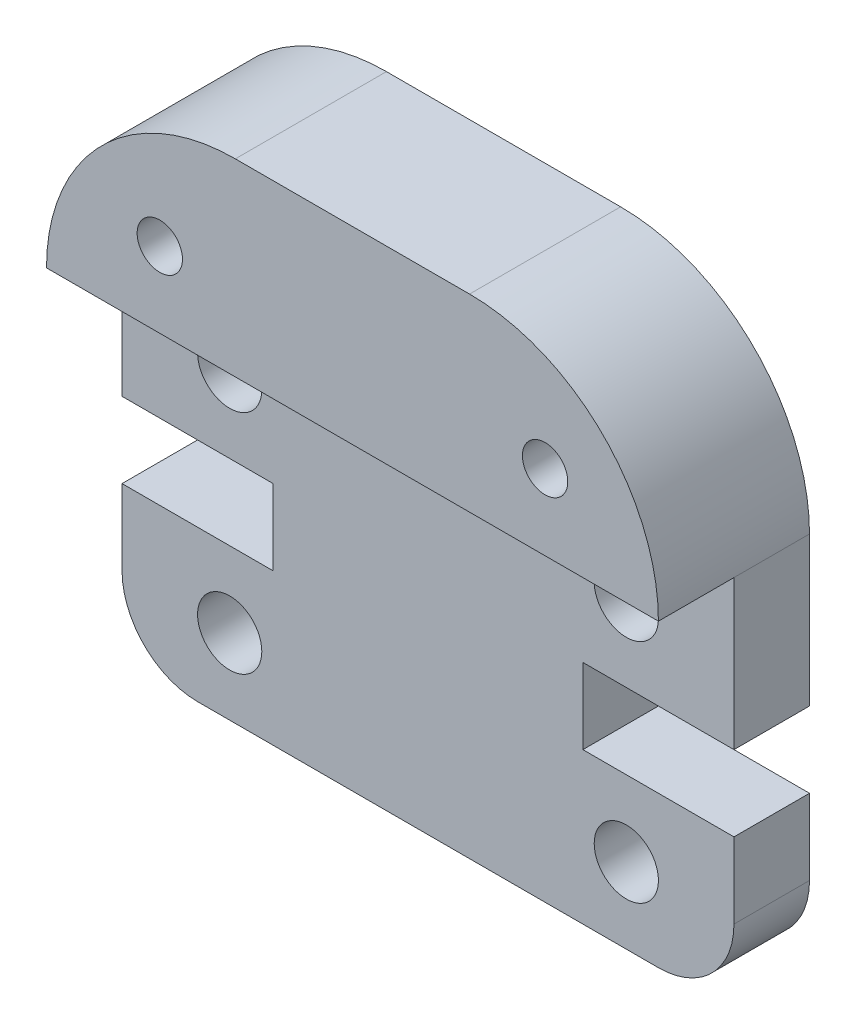
ISO-10303-21;
HEADER;
FILE_DESCRIPTION(('STEP AP214'),'2;1');
FILE_NAME('part.step','',(''),(''),'','','');
FILE_SCHEMA(('AUTOMOTIVE_DESIGN { 1 0 10303 214 1 1 1 1 }'));
ENDSEC;
DATA;
#1=APPLICATION_CONTEXT('core data for automotive mechanical design processes');
#2=APPLICATION_PROTOCOL_DEFINITION('international standard','automotive_design',2000,#1);
#3=PRODUCT_CONTEXT('',#1,'mechanical');
#4=PRODUCT('Part','Part','',(#3));
#5=PRODUCT_RELATED_PRODUCT_CATEGORY('part','',(#4));
#6=PRODUCT_DEFINITION_FORMATION('','',#4);
#7=PRODUCT_DEFINITION_CONTEXT('part definition',#1,'design');
#8=PRODUCT_DEFINITION('design','',#6,#7);
#9=PRODUCT_DEFINITION_SHAPE('','',#8);
#10=(LENGTH_UNIT() NAMED_UNIT(*) SI_UNIT(.MILLI.,.METRE.));
#11=(NAMED_UNIT(*) PLANE_ANGLE_UNIT() SI_UNIT($,.RADIAN.));
#12=(NAMED_UNIT(*) SI_UNIT($,.STERADIAN.) SOLID_ANGLE_UNIT());
#13=UNCERTAINTY_MEASURE_WITH_UNIT(LENGTH_MEASURE(1.E-05),#10,'distance_accuracy_value','');
#14=(GEOMETRIC_REPRESENTATION_CONTEXT(3) GLOBAL_UNCERTAINTY_ASSIGNED_CONTEXT((#13)) GLOBAL_UNIT_ASSIGNED_CONTEXT((#10,
#11,#12)) REPRESENTATION_CONTEXT('',''));
#15=CARTESIAN_POINT('',(0.,0.,0.));
#16=DIRECTION('',(0.,0.,1.));
#17=DIRECTION('',(1.,0.,0.));
#18=AXIS2_PLACEMENT_3D('',#15,#16,#17);
#19=CARTESIAN_POINT('',(14.2,2.,4.));
#20=DIRECTION('',(0.,0.,-1.));
#21=DIRECTION('',(-1.,0.,0.));
#22=AXIS2_PLACEMENT_3D('',#19,#20,#21);
#23=PLANE('',#22);
#24=CARTESIAN_POINT('',(3.00000000000321,11.942,4.));
#25=DIRECTION('',(0.,0.,1.));
#26=DIRECTION('',(1.,0.,0.));
#27=AXIS2_PLACEMENT_3D('',#24,#25,#26);
#28=CIRCLE('',#27,0.6);
#29=CARTESIAN_POINT('',(3.60000000000321,11.942,4.));
#30=VERTEX_POINT('',#29);
#31=EDGE_CURVE('E325',#30,#30,#28,.T.);
#32=ORIENTED_EDGE('',*,*,#31,.F.);
#33=EDGE_LOOP('',(#32));
#34=FACE_BOUND('',#33,.T.);
#35=CARTESIAN_POINT('',(13.1999999999968,11.942,4.));
#36=DIRECTION('',(0.,0.,1.));
#37=DIRECTION('',(-1.,0.,0.));
#38=AXIS2_PLACEMENT_3D('',#35,#36,#37);
#39=CIRCLE('',#38,0.6);
#40=CARTESIAN_POINT('',(12.5999999999968,11.942,4.));
#41=VERTEX_POINT('',#40);
#42=EDGE_CURVE('E331',#41,#41,#39,.T.);
#43=ORIENTED_EDGE('',*,*,#42,.F.);
#44=EDGE_LOOP('',(#43));
#45=FACE_BOUND('',#44,.T.);
#46=DIRECTION('',(1.,0.,0.));
#47=VECTOR('',#46,1.);
#48=CARTESIAN_POINT('',(16.2,9.945,4.));
#49=LINE('',#48,#47);
#50=CARTESIAN_POINT('',(0.,9.94499999999999,4.));
#51=VERTEX_POINT('',#50);
#52=CARTESIAN_POINT('',(16.2,9.945,4.));
#53=VERTEX_POINT('',#52);
#54=EDGE_CURVE('E277',#51,#53,#49,.T.);
#55=ORIENTED_EDGE('',*,*,#54,.T.);
#56=CARTESIAN_POINT('',(11.2,9.94499999999999,4.));
#57=DIRECTION('',(0.,0.,1.));
#58=DIRECTION('',(-1.,0.,0.));
#59=AXIS2_PLACEMENT_3D('',#56,#57,#58);
#60=CIRCLE('',#59,5.);
#61=CARTESIAN_POINT('',(11.2,14.945,4.));
#62=VERTEX_POINT('',#61);
#63=EDGE_CURVE('E131',#53,#62,#60,.T.);
#64=ORIENTED_EDGE('',*,*,#63,.T.);
#65=DIRECTION('',(-1.,0.,0.));
#66=VECTOR('',#65,1.);
#67=CARTESIAN_POINT('',(5.,14.945,4.));
#68=LINE('',#67,#66);
#69=CARTESIAN_POINT('',(5.,14.945,4.));
#70=VERTEX_POINT('',#69);
#71=EDGE_CURVE('E57',#62,#70,#68,.T.);
#72=ORIENTED_EDGE('',*,*,#71,.T.);
#73=CARTESIAN_POINT('',(5.,9.94499999999999,4.));
#74=DIRECTION('',(0.,0.,1.));
#75=DIRECTION('',(1.,0.,0.));
#76=AXIS2_PLACEMENT_3D('',#73,#74,#75);
#77=CIRCLE('',#76,5.);
#78=EDGE_CURVE('E122',#70,#51,#77,.T.);
#79=ORIENTED_EDGE('',*,*,#78,.T.);
#80=EDGE_LOOP('',(#55,#64,#72,#79));
#81=FACE_BOUND('',#80,.T.);
#82=ADVANCED_FACE('F32',(#34,#45,#81),#23,.F.);
#83=CARTESIAN_POINT('',(14.2,2.,4.));
#84=DIRECTION('',(0.,0.,-1.));
#85=DIRECTION('',(-1.,0.,0.));
#86=AXIS2_PLACEMENT_3D('',#83,#84,#85);
#87=CYLINDRICAL_SURFACE('',#86,2.);
#88=CARTESIAN_POINT('',(14.2,2.,2.));
#89=DIRECTION('',(0.,0.,1.));
#90=DIRECTION('',(1.,0.,0.));
#91=AXIS2_PLACEMENT_3D('',#88,#89,#90);
#92=CIRCLE('',#91,2.);
#93=CARTESIAN_POINT('',(14.2,0.,2.));
#94=VERTEX_POINT('',#93);
#95=CARTESIAN_POINT('',(16.2,2.,2.));
#96=VERTEX_POINT('',#95);
#97=EDGE_CURVE('E119',#94,#96,#92,.T.);
#98=ORIENTED_EDGE('',*,*,#97,.F.);
#99=DIRECTION('',(0.,0.,-1.));
#100=VECTOR('',#99,1.);
#101=CARTESIAN_POINT('',(14.2,0.,4.));
#102=LINE('',#101,#100);
#103=CARTESIAN_POINT('',(14.2,0.,0.));
#104=VERTEX_POINT('',#103);
#105=EDGE_CURVE('E112',#94,#104,#102,.T.);
#106=ORIENTED_EDGE('',*,*,#105,.T.);
#107=CARTESIAN_POINT('',(14.2,2.,0.));
#108=DIRECTION('',(0.,0.,1.));
#109=DIRECTION('',(-1.,0.,0.));
#110=AXIS2_PLACEMENT_3D('',#107,#108,#109);
#111=CIRCLE('',#110,2.);
#112=CARTESIAN_POINT('',(16.2,2.,0.));
#113=VERTEX_POINT('',#112);
#114=EDGE_CURVE('E116',#104,#113,#111,.T.);
#115=ORIENTED_EDGE('',*,*,#114,.T.);
#116=DIRECTION('',(0.,0.,-1.));
#117=VECTOR('',#116,1.);
#118=CARTESIAN_POINT('',(16.2,2.,4.));
#119=LINE('',#118,#117);
#120=EDGE_CURVE('E11',#96,#113,#119,.T.);
#121=ORIENTED_EDGE('',*,*,#120,.F.);
#122=EDGE_LOOP('',(#98,#106,#115,#121));
#123=FACE_BOUND('',#122,.T.);
#124=ADVANCED_FACE('F34',(#123),#87,.T.);
#125=CARTESIAN_POINT('',(16.2,2.,4.));
#126=DIRECTION('',(-1.,0.,0.));
#127=DIRECTION('',(0.,0.,1.));
#128=AXIS2_PLACEMENT_3D('',#125,#126,#127);
#129=PLANE('',#128);
#130=DIRECTION('',(0.,-1.,0.));
#131=VECTOR('',#130,1.);
#132=CARTESIAN_POINT('',(16.2,0.,2.));
#133=LINE('',#132,#131);
#134=CARTESIAN_POINT('',(16.2,4.,2.));
#135=VERTEX_POINT('',#134);
#136=EDGE_CURVE('E340',#135,#96,#133,.T.);
#137=ORIENTED_EDGE('',*,*,#136,.T.);
#138=ORIENTED_EDGE('',*,*,#120,.T.);
#139=DIRECTION('',(0.,1.,0.));
#140=VECTOR('',#139,1.);
#141=CARTESIAN_POINT('',(16.2,2.,0.));
#142=LINE('',#141,#140);
#143=CARTESIAN_POINT('',(16.2,4.,0.));
#144=VERTEX_POINT('',#143);
#145=EDGE_CURVE('E139',#113,#144,#142,.T.);
#146=ORIENTED_EDGE('',*,*,#145,.T.);
#147=DIRECTION('',(0.,0.,-1.));
#148=VECTOR('',#147,1.);
#149=CARTESIAN_POINT('',(16.2,4.,4.));
#150=LINE('',#149,#148);
#151=EDGE_CURVE('E41',#135,#144,#150,.T.);
#152=ORIENTED_EDGE('',*,*,#151,.F.);
#153=EDGE_LOOP('',(#137,#138,#146,#152));
#154=FACE_BOUND('',#153,.T.);
#155=ADVANCED_FACE('F226',(#154),#129,.F.);
#156=CARTESIAN_POINT('',(12.2,4.,4.));
#157=DIRECTION('',(0.,-1.,0.));
#158=DIRECTION('',(1.,0.,0.));
#159=AXIS2_PLACEMENT_3D('',#156,#157,#158);
#160=PLANE('',#159);
#161=DIRECTION('',(-1.,0.,0.));
#162=VECTOR('',#161,1.);
#163=CARTESIAN_POINT('',(12.2,4.,2.));
#164=LINE('',#163,#162);
#165=CARTESIAN_POINT('',(12.2,4.,2.));
#166=VERTEX_POINT('',#165);
#167=EDGE_CURVE('E223',#135,#166,#164,.T.);
#168=ORIENTED_EDGE('',*,*,#167,.F.);
#169=ORIENTED_EDGE('',*,*,#151,.T.);
#170=DIRECTION('',(-1.,0.,0.));
#171=VECTOR('',#170,1.);
#172=CARTESIAN_POINT('',(12.2,4.,0.));
#173=LINE('',#172,#171);
#174=CARTESIAN_POINT('',(12.2,4.,0.));
#175=VERTEX_POINT('',#174);
#176=EDGE_CURVE('E142',#144,#175,#173,.T.);
#177=ORIENTED_EDGE('',*,*,#176,.T.);
#178=DIRECTION('',(0.,0.,-1.));
#179=VECTOR('',#178,1.);
#180=CARTESIAN_POINT('',(12.2,4.,4.));
#181=LINE('',#180,#179);
#182=EDGE_CURVE('E213',#166,#175,#181,.T.);
#183=ORIENTED_EDGE('',*,*,#182,.F.);
#184=EDGE_LOOP('',(#168,#169,#177,#183));
#185=FACE_BOUND('',#184,.T.);
#186=ADVANCED_FACE('F218',(#185),#160,.F.);
#187=CARTESIAN_POINT('',(12.2,6.,4.));
#188=DIRECTION('',(-1.,0.,0.));
#189=DIRECTION('',(0.,0.,1.));
#190=AXIS2_PLACEMENT_3D('',#187,#188,#189);
#191=PLANE('',#190);
#192=DIRECTION('',(0.,1.,0.));
#193=VECTOR('',#192,1.);
#194=CARTESIAN_POINT('',(12.2,6.,2.));
#195=LINE('',#194,#193);
#196=CARTESIAN_POINT('',(12.2,6.,2.));
#197=VERTEX_POINT('',#196);
#198=EDGE_CURVE('E235',#166,#197,#195,.T.);
#199=ORIENTED_EDGE('',*,*,#198,.F.);
#200=ORIENTED_EDGE('',*,*,#182,.T.);
#201=DIRECTION('',(0.,1.,0.));
#202=VECTOR('',#201,1.);
#203=CARTESIAN_POINT('',(12.2,6.,0.));
#204=LINE('',#203,#202);
#205=CARTESIAN_POINT('',(12.2,6.,0.));
#206=VERTEX_POINT('',#205);
#207=EDGE_CURVE('E152',#175,#206,#204,.T.);
#208=ORIENTED_EDGE('',*,*,#207,.T.);
#209=DIRECTION('',(0.,0.,-1.));
#210=VECTOR('',#209,1.);
#211=CARTESIAN_POINT('',(12.2,6.,4.));
#212=LINE('',#211,#210);
#213=EDGE_CURVE('E211',#197,#206,#212,.T.);
#214=ORIENTED_EDGE('',*,*,#213,.F.);
#215=EDGE_LOOP('',(#199,#200,#208,#214));
#216=FACE_BOUND('',#215,.T.);
#217=ADVANCED_FACE('F232',(#216),#191,.F.);
#218=CARTESIAN_POINT('',(16.2,6.00000000000001,4.));
#219=DIRECTION('',(0.,1.,0.));
#220=DIRECTION('',(-1.,0.,0.));
#221=AXIS2_PLACEMENT_3D('',#218,#219,#220);
#222=PLANE('',#221);
#223=DIRECTION('',(1.,0.,0.));
#224=VECTOR('',#223,1.);
#225=CARTESIAN_POINT('',(16.2,6.00000000000001,2.));
#226=LINE('',#225,#224);
#227=CARTESIAN_POINT('',(16.2,6.00000000000001,2.));
#228=VERTEX_POINT('',#227);
#229=EDGE_CURVE('E307',#197,#228,#226,.T.);
#230=ORIENTED_EDGE('',*,*,#229,.F.);
#231=ORIENTED_EDGE('',*,*,#213,.T.);
#232=DIRECTION('',(1.,0.,0.));
#233=VECTOR('',#232,1.);
#234=CARTESIAN_POINT('',(16.2,6.00000000000001,0.));
#235=LINE('',#234,#233);
#236=CARTESIAN_POINT('',(16.2,6.00000000000001,0.));
#237=VERTEX_POINT('',#236);
#238=EDGE_CURVE('E155',#206,#237,#235,.T.);
#239=ORIENTED_EDGE('',*,*,#238,.T.);
#240=DIRECTION('',(0.,0.,-1.));
#241=VECTOR('',#240,1.);
#242=CARTESIAN_POINT('',(16.2,6.00000000000001,4.));
#243=LINE('',#242,#241);
#244=EDGE_CURVE('E209',#228,#237,#243,.T.);
#245=ORIENTED_EDGE('',*,*,#244,.F.);
#246=EDGE_LOOP('',(#230,#231,#239,#245));
#247=FACE_BOUND('',#246,.T.);
#248=ADVANCED_FACE('F352',(#247),#222,.F.);
#249=CARTESIAN_POINT('',(16.2,9.945,4.));
#250=DIRECTION('',(-1.,0.,0.));
#251=DIRECTION('',(0.,-1.,0.));
#252=AXIS2_PLACEMENT_3D('',#249,#250,#251);
#253=PLANE('',#252);
#254=CARTESIAN_POINT('',(16.2,9.945,2.));
#255=VERTEX_POINT('',#254);
#256=EDGE_CURVE('E286',#255,#228,#133,.T.);
#257=ORIENTED_EDGE('',*,*,#256,.T.);
#258=ORIENTED_EDGE('',*,*,#244,.T.);
#259=DIRECTION('',(0.,1.,0.));
#260=VECTOR('',#259,1.);
#261=CARTESIAN_POINT('',(16.2,9.945,0.));
#262=LINE('',#261,#260);
#263=CARTESIAN_POINT('',(16.2,9.945,0.));
#264=VERTEX_POINT('',#263);
#265=EDGE_CURVE('E158',#237,#264,#262,.T.);
#266=ORIENTED_EDGE('',*,*,#265,.T.);
#267=DIRECTION('',(0.,0.,-1.));
#268=VECTOR('',#267,1.);
#269=CARTESIAN_POINT('',(16.2,9.945,4.));
#270=LINE('',#269,#268);
#271=EDGE_CURVE('E205',#255,#264,#270,.T.);
#272=ORIENTED_EDGE('',*,*,#271,.F.);
#273=EDGE_LOOP('',(#257,#258,#266,#272));
#274=FACE_BOUND('',#273,.T.);
#275=ADVANCED_FACE('F348',(#274),#253,.F.);
#276=CARTESIAN_POINT('',(0.,9.94499999999999,4.));
#277=DIRECTION('',(1.,0.,0.));
#278=DIRECTION('',(0.,0.,-1.));
#279=AXIS2_PLACEMENT_3D('',#276,#277,#278);
#280=PLANE('',#279);
#281=DIRECTION('',(0.,1.,0.));
#282=VECTOR('',#281,1.);
#283=CARTESIAN_POINT('',(0.,9.94499999999999,2.));
#284=LINE('',#283,#282);
#285=CARTESIAN_POINT('',(0.,6.00000000000001,2.));
#286=VERTEX_POINT('',#285);
#287=CARTESIAN_POINT('',(0.,9.94499999999999,2.));
#288=VERTEX_POINT('',#287);
#289=EDGE_CURVE('E283',#286,#288,#284,.T.);
#290=ORIENTED_EDGE('',*,*,#289,.T.);
#291=DIRECTION('',(0.,0.,-1.));
#292=VECTOR('',#291,1.);
#293=CARTESIAN_POINT('',(0.,9.94499999999999,4.));
#294=LINE('',#293,#292);
#295=CARTESIAN_POINT('',(0.,9.94499999999999,0.));
#296=VERTEX_POINT('',#295);
#297=EDGE_CURVE('E195',#288,#296,#294,.T.);
#298=ORIENTED_EDGE('',*,*,#297,.T.);
#299=DIRECTION('',(0.,-1.,0.));
#300=VECTOR('',#299,1.);
#301=CARTESIAN_POINT('',(0.,9.94499999999999,0.));
#302=LINE('',#301,#300);
#303=CARTESIAN_POINT('',(0.,6.00000000000001,0.));
#304=VERTEX_POINT('',#303);
#305=EDGE_CURVE('E168',#296,#304,#302,.T.);
#306=ORIENTED_EDGE('',*,*,#305,.T.);
#307=DIRECTION('',(0.,0.,-1.));
#308=VECTOR('',#307,1.);
#309=CARTESIAN_POINT('',(0.,6.00000000000001,4.));
#310=LINE('',#309,#308);
#311=EDGE_CURVE('E193',#286,#304,#310,.T.);
#312=ORIENTED_EDGE('',*,*,#311,.F.);
#313=EDGE_LOOP('',(#290,#298,#306,#312));
#314=FACE_BOUND('',#313,.T.);
#315=ADVANCED_FACE('F292',(#314),#280,.F.);
#316=CARTESIAN_POINT('',(0.,6.00000000000001,4.));
#317=DIRECTION('',(0.,1.,0.));
#318=DIRECTION('',(0.,0.,1.));
#319=AXIS2_PLACEMENT_3D('',#316,#317,#318);
#320=PLANE('',#319);
#321=DIRECTION('',(1.,0.,0.));
#322=VECTOR('',#321,1.);
#323=CARTESIAN_POINT('',(0.,6.00000000000001,2.));
#324=LINE('',#323,#322);
#325=CARTESIAN_POINT('',(4.,6.00000000000001,2.));
#326=VERTEX_POINT('',#325);
#327=EDGE_CURVE('E305',#286,#326,#324,.T.);
#328=ORIENTED_EDGE('',*,*,#327,.F.);
#329=ORIENTED_EDGE('',*,*,#311,.T.);
#330=DIRECTION('',(1.,0.,0.));
#331=VECTOR('',#330,1.);
#332=CARTESIAN_POINT('',(0.,6.00000000000001,0.));
#333=LINE('',#332,#331);
#334=CARTESIAN_POINT('',(4.,6.00000000000001,0.));
#335=VERTEX_POINT('',#334);
#336=EDGE_CURVE('E171',#304,#335,#333,.T.);
#337=ORIENTED_EDGE('',*,*,#336,.T.);
#338=DIRECTION('',(0.,0.,-1.));
#339=VECTOR('',#338,1.);
#340=CARTESIAN_POINT('',(4.,6.00000000000001,4.));
#341=LINE('',#340,#339);
#342=EDGE_CURVE('E191',#326,#335,#341,.T.);
#343=ORIENTED_EDGE('',*,*,#342,.F.);
#344=EDGE_LOOP('',(#328,#329,#337,#343));
#345=FACE_BOUND('',#344,.T.);
#346=ADVANCED_FACE('F304',(#345),#320,.F.);
#347=CARTESIAN_POINT('',(4.,6.00000000000001,4.));
#348=DIRECTION('',(1.,0.,0.));
#349=DIRECTION('',(0.,0.,-1.));
#350=AXIS2_PLACEMENT_3D('',#347,#348,#349);
#351=PLANE('',#350);
#352=DIRECTION('',(0.,-1.,0.));
#353=VECTOR('',#352,1.);
#354=CARTESIAN_POINT('',(4.,6.00000000000001,2.));
#355=LINE('',#354,#353);
#356=CARTESIAN_POINT('',(4.,4.,2.));
#357=VERTEX_POINT('',#356);
#358=EDGE_CURVE('E308',#326,#357,#355,.T.);
#359=ORIENTED_EDGE('',*,*,#358,.F.);
#360=ORIENTED_EDGE('',*,*,#342,.T.);
#361=DIRECTION('',(0.,-1.,0.));
#362=VECTOR('',#361,1.);
#363=CARTESIAN_POINT('',(4.,6.00000000000001,0.));
#364=LINE('',#363,#362);
#365=CARTESIAN_POINT('',(4.,4.,0.));
#366=VERTEX_POINT('',#365);
#367=EDGE_CURVE('E174',#335,#366,#364,.T.);
#368=ORIENTED_EDGE('',*,*,#367,.T.);
#369=DIRECTION('',(0.,0.,-1.));
#370=VECTOR('',#369,1.);
#371=CARTESIAN_POINT('',(4.,4.,4.));
#372=LINE('',#371,#370);
#373=EDGE_CURVE('E189',#357,#366,#372,.T.);
#374=ORIENTED_EDGE('',*,*,#373,.F.);
#375=EDGE_LOOP('',(#359,#360,#368,#374));
#376=FACE_BOUND('',#375,.T.);
#377=ADVANCED_FACE('F390',(#376),#351,.F.);
#378=CARTESIAN_POINT('',(4.,4.,4.));
#379=DIRECTION('',(0.,-1.,0.));
#380=DIRECTION('',(0.,0.,-1.));
#381=AXIS2_PLACEMENT_3D('',#378,#379,#380);
#382=PLANE('',#381);
#383=DIRECTION('',(-1.,0.,0.));
#384=VECTOR('',#383,1.);
#385=CARTESIAN_POINT('',(4.,4.,2.));
#386=LINE('',#385,#384);
#387=CARTESIAN_POINT('',(0.,4.,2.));
#388=VERTEX_POINT('',#387);
#389=EDGE_CURVE('E311',#357,#388,#386,.T.);
#390=ORIENTED_EDGE('',*,*,#389,.F.);
#391=ORIENTED_EDGE('',*,*,#373,.T.);
#392=DIRECTION('',(-1.,0.,0.));
#393=VECTOR('',#392,1.);
#394=CARTESIAN_POINT('',(4.,4.,0.));
#395=LINE('',#394,#393);
#396=CARTESIAN_POINT('',(0.,4.,0.));
#397=VERTEX_POINT('',#396);
#398=EDGE_CURVE('E177',#366,#397,#395,.T.);
#399=ORIENTED_EDGE('',*,*,#398,.T.);
#400=DIRECTION('',(0.,0.,-1.));
#401=VECTOR('',#400,1.);
#402=CARTESIAN_POINT('',(0.,4.,4.));
#403=LINE('',#402,#401);
#404=EDGE_CURVE('E187',#388,#397,#403,.T.);
#405=ORIENTED_EDGE('',*,*,#404,.F.);
#406=EDGE_LOOP('',(#390,#391,#399,#405));
#407=FACE_BOUND('',#406,.T.);
#408=ADVANCED_FACE('F386',(#407),#382,.F.);
#409=CARTESIAN_POINT('',(0.,2.,4.));
#410=DIRECTION('',(1.,0.,0.));
#411=DIRECTION('',(0.,0.,-1.));
#412=AXIS2_PLACEMENT_3D('',#409,#410,#411);
#413=PLANE('',#412);
#414=CARTESIAN_POINT('',(0.,2.,2.));
#415=VERTEX_POINT('',#414);
#416=EDGE_CURVE('E288',#415,#388,#284,.T.);
#417=ORIENTED_EDGE('',*,*,#416,.T.);
#418=ORIENTED_EDGE('',*,*,#404,.T.);
#419=DIRECTION('',(0.,-1.,0.));
#420=VECTOR('',#419,1.);
#421=CARTESIAN_POINT('',(0.,2.,0.));
#422=LINE('',#421,#420);
#423=CARTESIAN_POINT('',(0.,2.,0.));
#424=VERTEX_POINT('',#423);
#425=EDGE_CURVE('E180',#397,#424,#422,.T.);
#426=ORIENTED_EDGE('',*,*,#425,.T.);
#427=DIRECTION('',(0.,0.,-1.));
#428=VECTOR('',#427,1.);
#429=CARTESIAN_POINT('',(0.,2.,4.));
#430=LINE('',#429,#428);
#431=EDGE_CURVE('E185',#415,#424,#430,.T.);
#432=ORIENTED_EDGE('',*,*,#431,.F.);
#433=EDGE_LOOP('',(#417,#418,#426,#432));
#434=FACE_BOUND('',#433,.T.);
#435=ADVANCED_FACE('F382',(#434),#413,.F.);
#436=CARTESIAN_POINT('',(2.,2.,4.));
#437=DIRECTION('',(0.,0.,-1.));
#438=DIRECTION('',(-1.,0.,0.));
#439=AXIS2_PLACEMENT_3D('',#436,#437,#438);
#440=CYLINDRICAL_SURFACE('',#439,2.);
#441=CARTESIAN_POINT('',(2.,2.,2.));
#442=DIRECTION('',(0.,0.,1.));
#443=DIRECTION('',(1.,0.,0.));
#444=AXIS2_PLACEMENT_3D('',#441,#442,#443);
#445=CIRCLE('',#444,2.);
#446=CARTESIAN_POINT('',(2.,0.,2.));
#447=VERTEX_POINT('',#446);
#448=EDGE_CURVE('E48',#415,#447,#445,.T.);
#449=ORIENTED_EDGE('',*,*,#448,.F.);
#450=ORIENTED_EDGE('',*,*,#431,.T.);
#451=CARTESIAN_POINT('',(2.,2.,0.));
#452=DIRECTION('',(0.,0.,1.));
#453=DIRECTION('',(1.,0.,0.));
#454=AXIS2_PLACEMENT_3D('',#451,#452,#453);
#455=CIRCLE('',#454,2.);
#456=CARTESIAN_POINT('',(2.,0.,0.));
#457=VERTEX_POINT('',#456);
#458=EDGE_CURVE('E132',#424,#457,#455,.T.);
#459=ORIENTED_EDGE('',*,*,#458,.T.);
#460=DIRECTION('',(0.,0.,-1.));
#461=VECTOR('',#460,1.);
#462=CARTESIAN_POINT('',(2.,0.,4.));
#463=LINE('',#462,#461);
#464=EDGE_CURVE('E121',#447,#457,#463,.T.);
#465=ORIENTED_EDGE('',*,*,#464,.F.);
#466=EDGE_LOOP('',(#449,#450,#459,#465));
#467=FACE_BOUND('',#466,.T.);
#468=ADVANCED_FACE('F379',(#467),#440,.T.);
#469=CARTESIAN_POINT('',(2.,0.,4.));
#470=DIRECTION('',(0.,1.,0.));
#471=DIRECTION('',(-1.,0.,0.));
#472=AXIS2_PLACEMENT_3D('',#469,#470,#471);
#473=PLANE('',#472);
#474=DIRECTION('',(-1.,0.,0.));
#475=VECTOR('',#474,1.);
#476=CARTESIAN_POINT('',(0.,0.,2.));
#477=LINE('',#476,#475);
#478=EDGE_CURVE('E293',#94,#447,#477,.T.);
#479=ORIENTED_EDGE('',*,*,#478,.T.);
#480=ORIENTED_EDGE('',*,*,#464,.T.);
#481=DIRECTION('',(1.,0.,0.));
#482=VECTOR('',#481,1.);
#483=CARTESIAN_POINT('',(2.,0.,0.));
#484=LINE('',#483,#482);
#485=EDGE_CURVE('E125',#457,#104,#484,.T.);
#486=ORIENTED_EDGE('',*,*,#485,.T.);
#487=ORIENTED_EDGE('',*,*,#105,.F.);
#488=EDGE_LOOP('',(#479,#480,#486,#487));
#489=FACE_BOUND('',#488,.T.);
#490=ADVANCED_FACE('F126',(#489),#473,.F.);
#491=CARTESIAN_POINT('',(13.35,8.,4.));
#492=DIRECTION('',(0.,0.,-1.));
#493=DIRECTION('',(-1.,0.,0.));
#494=AXIS2_PLACEMENT_3D('',#491,#492,#493);
#495=CYLINDRICAL_SURFACE('',#494,0.85);
#496=CARTESIAN_POINT('',(13.35,8.,0.));
#497=DIRECTION('',(0.,0.,1.));
#498=DIRECTION('',(1.,0.,0.));
#499=AXIS2_PLACEMENT_3D('',#496,#497,#498);
#500=CIRCLE('',#499,0.85);
#501=CARTESIAN_POINT('',(14.2,8.,0.));
#502=VERTEX_POINT('',#501);
#503=EDGE_CURVE('E140',#502,#502,#500,.T.);
#504=ORIENTED_EDGE('',*,*,#503,.F.);
#505=EDGE_LOOP('',(#504));
#506=FACE_BOUND('',#505,.T.);
#507=CARTESIAN_POINT('',(13.35,8.,2.));
#508=DIRECTION('',(0.,0.,1.));
#509=DIRECTION('',(1.,0.,0.));
#510=AXIS2_PLACEMENT_3D('',#507,#508,#509);
#511=CIRCLE('',#510,0.85);
#512=CARTESIAN_POINT('',(14.2,8.,2.));
#513=VERTEX_POINT('',#512);
#514=EDGE_CURVE('E592',#513,#513,#511,.T.);
#515=ORIENTED_EDGE('',*,*,#514,.T.);
#516=EDGE_LOOP('',(#515));
#517=FACE_BOUND('',#516,.T.);
#518=ADVANCED_FACE('F371',(#506,#517),#495,.F.);
#519=CARTESIAN_POINT('',(13.35,2.,4.));
#520=DIRECTION('',(0.,0.,-1.));
#521=DIRECTION('',(-1.,0.,0.));
#522=AXIS2_PLACEMENT_3D('',#519,#520,#521);
#523=CYLINDRICAL_SURFACE('',#522,0.85);
#524=CARTESIAN_POINT('',(13.35,2.,0.));
#525=DIRECTION('',(0.,0.,1.));
#526=DIRECTION('',(-1.,0.,0.));
#527=AXIS2_PLACEMENT_3D('',#524,#525,#526);
#528=CIRCLE('',#527,0.85);
#529=CARTESIAN_POINT('',(12.5,2.,0.));
#530=VERTEX_POINT('',#529);
#531=EDGE_CURVE('E145',#530,#530,#528,.T.);
#532=ORIENTED_EDGE('',*,*,#531,.F.);
#533=EDGE_LOOP('',(#532));
#534=FACE_BOUND('',#533,.T.);
#535=CARTESIAN_POINT('',(13.35,2.,2.));
#536=DIRECTION('',(0.,0.,1.));
#537=DIRECTION('',(1.,0.,0.));
#538=AXIS2_PLACEMENT_3D('',#535,#536,#537);
#539=CIRCLE('',#538,0.85);
#540=CARTESIAN_POINT('',(14.2,2.,2.));
#541=VERTEX_POINT('',#540);
#542=EDGE_CURVE('E587',#541,#541,#539,.T.);
#543=ORIENTED_EDGE('',*,*,#542,.T.);
#544=EDGE_LOOP('',(#543));
#545=FACE_BOUND('',#544,.T.);
#546=ADVANCED_FACE('F530',(#534,#545),#523,.F.);
#547=CARTESIAN_POINT('',(2.85,2.,4.));
#548=DIRECTION('',(0.,0.,-1.));
#549=DIRECTION('',(-1.,0.,0.));
#550=AXIS2_PLACEMENT_3D('',#547,#548,#549);
#551=CYLINDRICAL_SURFACE('',#550,0.85);
#552=CARTESIAN_POINT('',(2.85,2.,0.));
#553=DIRECTION('',(0.,0.,1.));
#554=DIRECTION('',(1.,0.,0.));
#555=AXIS2_PLACEMENT_3D('',#552,#553,#554);
#556=CIRCLE('',#555,0.85);
#557=CARTESIAN_POINT('',(3.7,2.,0.));
#558=VERTEX_POINT('',#557);
#559=EDGE_CURVE('E321',#558,#558,#556,.T.);
#560=ORIENTED_EDGE('',*,*,#559,.F.);
#561=EDGE_LOOP('',(#560));
#562=FACE_BOUND('',#561,.T.);
#563=CARTESIAN_POINT('',(2.85,2.,2.));
#564=DIRECTION('',(0.,0.,1.));
#565=DIRECTION('',(1.,0.,0.));
#566=AXIS2_PLACEMENT_3D('',#563,#564,#565);
#567=CIRCLE('',#566,0.85);
#568=CARTESIAN_POINT('',(3.7,2.,2.));
#569=VERTEX_POINT('',#568);
#570=EDGE_CURVE('E585',#569,#569,#567,.T.);
#571=ORIENTED_EDGE('',*,*,#570,.T.);
#572=EDGE_LOOP('',(#571));
#573=FACE_BOUND('',#572,.T.);
#574=ADVANCED_FACE('F538',(#562,#573),#551,.F.);
#575=CARTESIAN_POINT('',(2.85,8.,4.));
#576=DIRECTION('',(0.,0.,-1.));
#577=DIRECTION('',(-1.,0.,0.));
#578=AXIS2_PLACEMENT_3D('',#575,#576,#577);
#579=CYLINDRICAL_SURFACE('',#578,0.85);
#580=CARTESIAN_POINT('',(2.85,8.,0.));
#581=DIRECTION('',(0.,0.,1.));
#582=DIRECTION('',(-1.,0.,0.));
#583=AXIS2_PLACEMENT_3D('',#580,#581,#582);
#584=CIRCLE('',#583,0.85);
#585=CARTESIAN_POINT('',(2.,8.,0.));
#586=VERTEX_POINT('',#585);
#587=EDGE_CURVE('E318',#586,#586,#584,.T.);
#588=ORIENTED_EDGE('',*,*,#587,.F.);
#589=EDGE_LOOP('',(#588));
#590=FACE_BOUND('',#589,.T.);
#591=CARTESIAN_POINT('',(2.85,8.,2.));
#592=DIRECTION('',(0.,0.,1.));
#593=DIRECTION('',(1.,0.,0.));
#594=AXIS2_PLACEMENT_3D('',#591,#592,#593);
#595=CIRCLE('',#594,0.85);
#596=CARTESIAN_POINT('',(3.7,8.,2.));
#597=VERTEX_POINT('',#596);
#598=EDGE_CURVE('E36',#597,#597,#595,.T.);
#599=ORIENTED_EDGE('',*,*,#598,.T.);
#600=EDGE_LOOP('',(#599));
#601=FACE_BOUND('',#600,.T.);
#602=ADVANCED_FACE('F375',(#590,#601),#579,.F.);
#603=CARTESIAN_POINT('',(14.2,2.,0.));
#604=DIRECTION('',(0.,0.,-1.));
#605=DIRECTION('',(-1.,0.,0.));
#606=AXIS2_PLACEMENT_3D('',#603,#604,#605);
#607=PLANE('',#606);
#608=ORIENTED_EDGE('',*,*,#559,.T.);
#609=EDGE_LOOP('',(#608));
#610=FACE_BOUND('',#609,.T.);
#611=CARTESIAN_POINT('',(13.1999999999968,11.942,0.));
#612=DIRECTION('',(0.,0.,1.));
#613=DIRECTION('',(-1.,0.,0.));
#614=AXIS2_PLACEMENT_3D('',#611,#612,#613);
#615=CIRCLE('',#614,0.6);
#616=CARTESIAN_POINT('',(12.5999999999968,11.942,0.));
#617=VERTEX_POINT('',#616);
#618=EDGE_CURVE('E328',#617,#617,#615,.T.);
#619=ORIENTED_EDGE('',*,*,#618,.T.);
#620=EDGE_LOOP('',(#619));
#621=FACE_BOUND('',#620,.T.);
#622=ORIENTED_EDGE('',*,*,#503,.T.);
#623=EDGE_LOOP('',(#622));
#624=FACE_BOUND('',#623,.T.);
#625=ORIENTED_EDGE('',*,*,#114,.F.);
#626=ORIENTED_EDGE('',*,*,#485,.F.);
#627=ORIENTED_EDGE('',*,*,#458,.F.);
#628=ORIENTED_EDGE('',*,*,#425,.F.);
#629=ORIENTED_EDGE('',*,*,#398,.F.);
#630=ORIENTED_EDGE('',*,*,#367,.F.);
#631=ORIENTED_EDGE('',*,*,#336,.F.);
#632=ORIENTED_EDGE('',*,*,#305,.F.);
#633=CARTESIAN_POINT('',(5.,9.94499999999999,0.));
#634=DIRECTION('',(0.,0.,1.));
#635=DIRECTION('',(1.,0.,0.));
#636=AXIS2_PLACEMENT_3D('',#633,#634,#635);
#637=CIRCLE('',#636,5.);
#638=CARTESIAN_POINT('',(5.,14.945,0.));
#639=VERTEX_POINT('',#638);
#640=EDGE_CURVE('E165',#639,#296,#637,.T.);
#641=ORIENTED_EDGE('',*,*,#640,.F.);
#642=DIRECTION('',(-1.,0.,0.));
#643=VECTOR('',#642,1.);
#644=CARTESIAN_POINT('',(5.,14.945,0.));
#645=LINE('',#644,#643);
#646=CARTESIAN_POINT('',(11.2,14.945,0.));
#647=VERTEX_POINT('',#646);
#648=EDGE_CURVE('E163',#647,#639,#645,.T.);
#649=ORIENTED_EDGE('',*,*,#648,.F.);
#650=CARTESIAN_POINT('',(11.2,9.94499999999999,0.));
#651=DIRECTION('',(0.,0.,1.));
#652=DIRECTION('',(-1.,0.,0.));
#653=AXIS2_PLACEMENT_3D('',#650,#651,#652);
#654=CIRCLE('',#653,5.);
#655=EDGE_CURVE('E161',#264,#647,#654,.T.);
#656=ORIENTED_EDGE('',*,*,#655,.F.);
#657=ORIENTED_EDGE('',*,*,#265,.F.);
#658=ORIENTED_EDGE('',*,*,#238,.F.);
#659=ORIENTED_EDGE('',*,*,#207,.F.);
#660=ORIENTED_EDGE('',*,*,#176,.F.);
#661=ORIENTED_EDGE('',*,*,#145,.F.);
#662=EDGE_LOOP('',(#625,#626,#627,#628,#629,#630,#631,#632,#641,#649,#656,#657,#658,#659,#660,#661));
#663=FACE_BOUND('',#662,.T.);
#664=ORIENTED_EDGE('',*,*,#531,.T.);
#665=EDGE_LOOP('',(#664));
#666=FACE_BOUND('',#665,.T.);
#667=CARTESIAN_POINT('',(3.00000000000321,11.942,0.));
#668=DIRECTION('',(0.,0.,1.));
#669=DIRECTION('',(1.,0.,0.));
#670=AXIS2_PLACEMENT_3D('',#667,#668,#669);
#671=CIRCLE('',#670,0.6);
#672=CARTESIAN_POINT('',(3.60000000000321,11.942,0.));
#673=VERTEX_POINT('',#672);
#674=EDGE_CURVE('E324',#673,#673,#671,.T.);
#675=ORIENTED_EDGE('',*,*,#674,.T.);
#676=EDGE_LOOP('',(#675));
#677=FACE_BOUND('',#676,.T.);
#678=ORIENTED_EDGE('',*,*,#587,.T.);
#679=EDGE_LOOP('',(#678));
#680=FACE_BOUND('',#679,.T.);
#681=ADVANCED_FACE('F135',(#610,#621,#624,#663,#666,#677,#680),#607,.T.);
#682=CARTESIAN_POINT('',(11.2,9.94499999999999,4.));
#683=DIRECTION('',(0.,0.,-1.));
#684=DIRECTION('',(-1.,0.,0.));
#685=AXIS2_PLACEMENT_3D('',#682,#683,#684);
#686=CYLINDRICAL_SURFACE('',#685,5.);
#687=ORIENTED_EDGE('',*,*,#655,.T.);
#688=DIRECTION('',(0.,0.,-1.));
#689=VECTOR('',#688,1.);
#690=CARTESIAN_POINT('',(11.2,14.945,4.));
#691=LINE('',#690,#689);
#692=EDGE_CURVE('E202',#62,#647,#691,.T.);
#693=ORIENTED_EDGE('',*,*,#692,.F.);
#694=ORIENTED_EDGE('',*,*,#63,.F.);
#695=EDGE_CURVE('E206',#53,#255,#270,.T.);
#696=ORIENTED_EDGE('',*,*,#695,.T.);
#697=ORIENTED_EDGE('',*,*,#271,.T.);
#698=EDGE_LOOP('',(#687,#693,#694,#696,#697));
#699=FACE_BOUND('',#698,.T.);
#700=ADVANCED_FACE('F343',(#699),#686,.T.);
#701=CARTESIAN_POINT('',(5.,14.945,4.));
#702=DIRECTION('',(0.,-1.,0.));
#703=DIRECTION('',(0.,0.,-1.));
#704=AXIS2_PLACEMENT_3D('',#701,#702,#703);
#705=PLANE('',#704);
#706=ORIENTED_EDGE('',*,*,#648,.T.);
#707=DIRECTION('',(0.,0.,-1.));
#708=VECTOR('',#707,1.);
#709=CARTESIAN_POINT('',(5.,14.945,4.));
#710=LINE('',#709,#708);
#711=EDGE_CURVE('E199',#70,#639,#710,.T.);
#712=ORIENTED_EDGE('',*,*,#711,.F.);
#713=ORIENTED_EDGE('',*,*,#71,.F.);
#714=ORIENTED_EDGE('',*,*,#692,.T.);
#715=EDGE_LOOP('',(#706,#712,#713,#714));
#716=FACE_BOUND('',#715,.T.);
#717=ADVANCED_FACE('F346',(#716),#705,.F.);
#718=CARTESIAN_POINT('',(5.,9.94499999999999,4.));
#719=DIRECTION('',(0.,0.,-1.));
#720=DIRECTION('',(-1.,0.,0.));
#721=AXIS2_PLACEMENT_3D('',#718,#719,#720);
#722=CYLINDRICAL_SURFACE('',#721,5.);
#723=ORIENTED_EDGE('',*,*,#640,.T.);
#724=ORIENTED_EDGE('',*,*,#297,.F.);
#725=EDGE_CURVE('E196',#51,#288,#294,.T.);
#726=ORIENTED_EDGE('',*,*,#725,.F.);
#727=ORIENTED_EDGE('',*,*,#78,.F.);
#728=ORIENTED_EDGE('',*,*,#711,.T.);
#729=EDGE_LOOP('',(#723,#724,#726,#727,#728));
#730=FACE_BOUND('',#729,.T.);
#731=ADVANCED_FACE('F295',(#730),#722,.T.);
#732=CARTESIAN_POINT('',(13.1999999999968,11.942,4.));
#733=DIRECTION('',(0.,0.,-1.));
#734=DIRECTION('',(-1.,0.,0.));
#735=AXIS2_PLACEMENT_3D('',#732,#733,#734);
#736=CYLINDRICAL_SURFACE('',#735,0.6);
#737=ORIENTED_EDGE('',*,*,#42,.T.);
#738=EDGE_LOOP('',(#737));
#739=FACE_BOUND('',#738,.T.);
#740=ORIENTED_EDGE('',*,*,#618,.F.);
#741=EDGE_LOOP('',(#740));
#742=FACE_BOUND('',#741,.T.);
#743=ADVANCED_FACE('F401',(#739,#742),#736,.F.);
#744=CARTESIAN_POINT('',(3.00000000000321,11.942,4.));
#745=DIRECTION('',(0.,0.,-1.));
#746=DIRECTION('',(-1.,0.,0.));
#747=AXIS2_PLACEMENT_3D('',#744,#745,#746);
#748=CYLINDRICAL_SURFACE('',#747,0.6);
#749=ORIENTED_EDGE('',*,*,#31,.T.);
#750=EDGE_LOOP('',(#749));
#751=FACE_BOUND('',#750,.T.);
#752=ORIENTED_EDGE('',*,*,#674,.F.);
#753=EDGE_LOOP('',(#752));
#754=FACE_BOUND('',#753,.T.);
#755=ADVANCED_FACE('F426',(#751,#754),#748,.F.);
#756=CARTESIAN_POINT('',(0.,0.,2.));
#757=DIRECTION('',(0.,0.,1.));
#758=DIRECTION('',(1.,0.,0.));
#759=AXIS2_PLACEMENT_3D('',#756,#757,#758);
#760=PLANE('',#759);
#761=ORIENTED_EDGE('',*,*,#514,.F.);
#762=EDGE_LOOP('',(#761));
#763=FACE_BOUND('',#762,.T.);
#764=ORIENTED_EDGE('',*,*,#542,.F.);
#765=EDGE_LOOP('',(#764));
#766=FACE_BOUND('',#765,.T.);
#767=ORIENTED_EDGE('',*,*,#570,.F.);
#768=EDGE_LOOP('',(#767));
#769=FACE_BOUND('',#768,.T.);
#770=ORIENTED_EDGE('',*,*,#598,.F.);
#771=EDGE_LOOP('',(#770));
#772=FACE_BOUND('',#771,.T.);
#773=ORIENTED_EDGE('',*,*,#97,.T.);
#774=ORIENTED_EDGE('',*,*,#136,.F.);
#775=ORIENTED_EDGE('',*,*,#167,.T.);
#776=ORIENTED_EDGE('',*,*,#198,.T.);
#777=ORIENTED_EDGE('',*,*,#229,.T.);
#778=ORIENTED_EDGE('',*,*,#256,.F.);
#779=DIRECTION('',(1.,0.,0.));
#780=VECTOR('',#779,1.);
#781=CARTESIAN_POINT('',(16.2,9.945,2.));
#782=LINE('',#781,#780);
#783=EDGE_CURVE('E274',#288,#255,#782,.T.);
#784=ORIENTED_EDGE('',*,*,#783,.F.);
#785=ORIENTED_EDGE('',*,*,#289,.F.);
#786=ORIENTED_EDGE('',*,*,#327,.T.);
#787=ORIENTED_EDGE('',*,*,#358,.T.);
#788=ORIENTED_EDGE('',*,*,#389,.T.);
#789=ORIENTED_EDGE('',*,*,#416,.F.);
#790=ORIENTED_EDGE('',*,*,#448,.T.);
#791=ORIENTED_EDGE('',*,*,#478,.F.);
#792=EDGE_LOOP('',(#773,#774,#775,#776,#777,#778,#784,#785,#786,#787,#788,#789,#790,#791));
#793=FACE_BOUND('',#792,.T.);
#794=ADVANCED_FACE('F282',(#763,#766,#769,#772,#793),#760,.T.);
#795=CARTESIAN_POINT('',(16.2,9.945,2.));
#796=DIRECTION('',(0.,-1.,0.));
#797=DIRECTION('',(1.,0.,0.));
#798=AXIS2_PLACEMENT_3D('',#795,#796,#797);
#799=PLANE('',#798);
#800=ORIENTED_EDGE('',*,*,#54,.F.);
#801=ORIENTED_EDGE('',*,*,#725,.T.);
#802=ORIENTED_EDGE('',*,*,#783,.T.);
#803=ORIENTED_EDGE('',*,*,#695,.F.);
#804=EDGE_LOOP('',(#800,#801,#802,#803));
#805=FACE_BOUND('',#804,.T.);
#806=ADVANCED_FACE('F273',(#805),#799,.T.);
#807=CLOSED_SHELL('',(#82,#124,#155,#186,#217,#248,#275,#315,#346,#377,#408,#435,#468,#490,#518,
#546,#574,#602,#681,#700,#717,#731,#743,#755,#794,#806));
#808=MANIFOLD_SOLID_BREP('B2',#807);
#809=ADVANCED_BREP_SHAPE_REPRESENTATION('',(#18,#808),#14);
#810=SHAPE_DEFINITION_REPRESENTATION(#9,#809);
ENDSEC;
END-ISO-10303-21;
